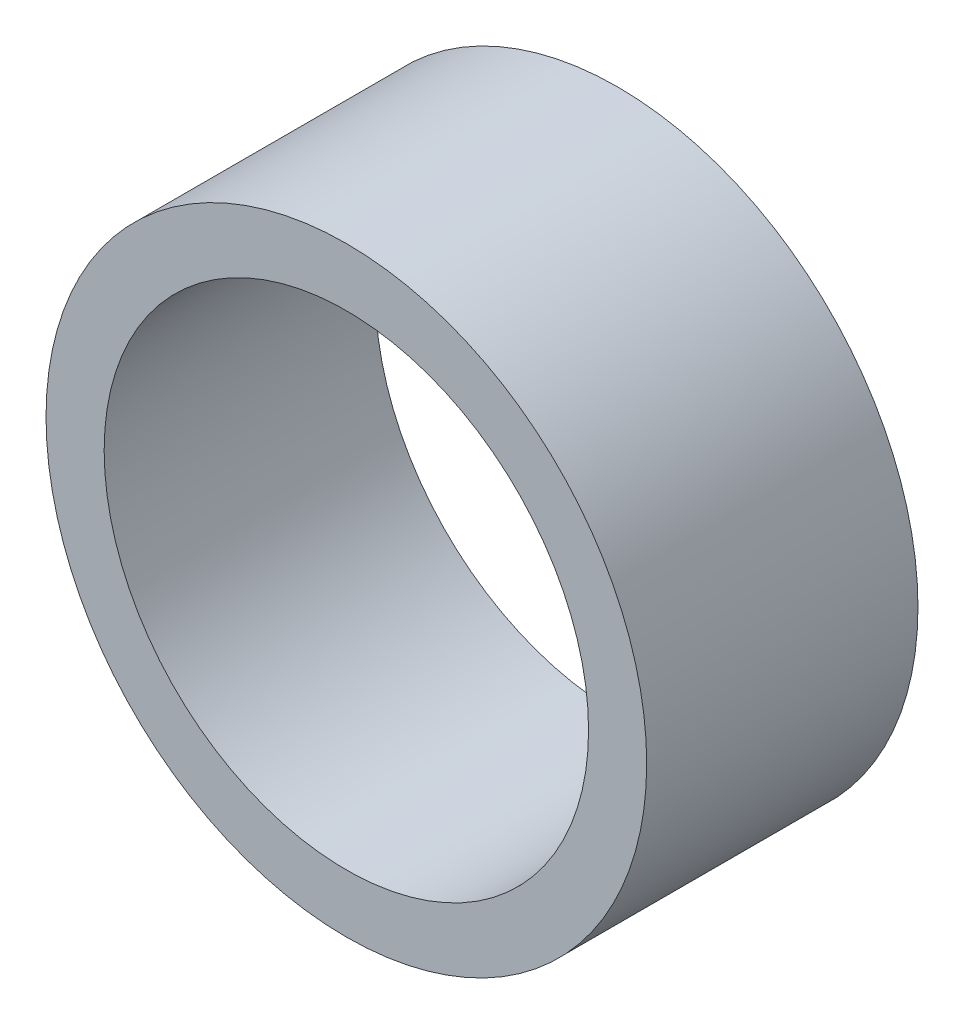
ISO-10303-21;
HEADER;
FILE_DESCRIPTION(('STEP AP214'),'2;1');
FILE_NAME('part.step','',(''),(''),'','','');
FILE_SCHEMA(('AUTOMOTIVE_DESIGN { 1 0 10303 214 1 1 1 1 }'));
ENDSEC;
DATA;
#1=APPLICATION_CONTEXT('core data for automotive mechanical design processes');
#2=APPLICATION_PROTOCOL_DEFINITION('international standard','automotive_design',2000,#1);
#3=PRODUCT_CONTEXT('',#1,'mechanical');
#4=PRODUCT('Part','Part','',(#3));
#5=PRODUCT_RELATED_PRODUCT_CATEGORY('part','',(#4));
#6=PRODUCT_DEFINITION_FORMATION('','',#4);
#7=PRODUCT_DEFINITION_CONTEXT('part definition',#1,'design');
#8=PRODUCT_DEFINITION('design','',#6,#7);
#9=PRODUCT_DEFINITION_SHAPE('','',#8);
#10=(LENGTH_UNIT() NAMED_UNIT(*) SI_UNIT(.MILLI.,.METRE.));
#11=(NAMED_UNIT(*) PLANE_ANGLE_UNIT() SI_UNIT($,.RADIAN.));
#12=(NAMED_UNIT(*) SI_UNIT($,.STERADIAN.) SOLID_ANGLE_UNIT());
#13=UNCERTAINTY_MEASURE_WITH_UNIT(LENGTH_MEASURE(1.E-05),#10,'distance_accuracy_value','');
#14=(GEOMETRIC_REPRESENTATION_CONTEXT(3) GLOBAL_UNCERTAINTY_ASSIGNED_CONTEXT((#13)) GLOBAL_UNIT_ASSIGNED_CONTEXT((#10,
#11,#12)) REPRESENTATION_CONTEXT('',''));
#15=CARTESIAN_POINT('',(0.,0.,0.));
#16=DIRECTION('',(0.,0.,1.));
#17=DIRECTION('',(1.,0.,0.));
#18=AXIS2_PLACEMENT_3D('',#15,#16,#17);
#19=CARTESIAN_POINT('',(0.,0.,14.));
#20=DIRECTION('',(0.,0.,1.));
#21=DIRECTION('',(1.,0.,0.));
#22=AXIS2_PLACEMENT_3D('',#19,#20,#21);
#23=CYLINDRICAL_SURFACE('',#22,12.5);
#24=CARTESIAN_POINT('',(0.,0.,0.));
#25=DIRECTION('',(0.,0.,1.));
#26=DIRECTION('',(1.,0.,0.));
#27=AXIS2_PLACEMENT_3D('',#24,#25,#26);
#28=CIRCLE('',#27,12.5);
#29=CARTESIAN_POINT('',(12.5,0.,0.));
#30=VERTEX_POINT('',#29);
#31=EDGE_CURVE('E26',#30,#30,#28,.F.);
#32=ORIENTED_EDGE('',*,*,#31,.T.);
#33=EDGE_LOOP('',(#32));
#34=FACE_BOUND('',#33,.T.);
#35=CARTESIAN_POINT('',(0.,0.,14.));
#36=DIRECTION('',(0.,0.,1.));
#37=DIRECTION('',(1.,0.,0.));
#38=AXIS2_PLACEMENT_3D('',#35,#36,#37);
#39=CIRCLE('',#38,12.5);
#40=CARTESIAN_POINT('',(12.5,0.,14.));
#41=VERTEX_POINT('',#40);
#42=EDGE_CURVE('E17',#41,#41,#39,.F.);
#43=ORIENTED_EDGE('',*,*,#42,.F.);
#44=EDGE_LOOP('',(#43));
#45=FACE_BOUND('',#44,.T.);
#46=ADVANCED_FACE('F14',(#34,#45),#23,.F.);
#47=CARTESIAN_POINT('',(0.,0.,14.));
#48=DIRECTION('',(0.,0.,1.));
#49=DIRECTION('',(1.,0.,0.));
#50=AXIS2_PLACEMENT_3D('',#47,#48,#49);
#51=PLANE('',#50);
#52=CARTESIAN_POINT('',(0.,0.,14.));
#53=DIRECTION('',(0.,0.,1.));
#54=DIRECTION('',(1.,0.,0.));
#55=AXIS2_PLACEMENT_3D('',#52,#53,#54);
#56=CIRCLE('',#55,15.5);
#57=CARTESIAN_POINT('',(15.5,0.,14.));
#58=VERTEX_POINT('',#57);
#59=EDGE_CURVE('E21',#58,#58,#56,.F.);
#60=ORIENTED_EDGE('',*,*,#59,.F.);
#61=EDGE_LOOP('',(#60));
#62=FACE_BOUND('',#61,.T.);
#63=ORIENTED_EDGE('',*,*,#42,.T.);
#64=EDGE_LOOP('',(#63));
#65=FACE_BOUND('',#64,.T.);
#66=ADVANCED_FACE('F34',(#62,#65),#51,.T.);
#67=CARTESIAN_POINT('',(0.,0.,0.));
#68=DIRECTION('',(0.,0.,1.));
#69=DIRECTION('',(1.,0.,0.));
#70=AXIS2_PLACEMENT_3D('',#67,#68,#69);
#71=PLANE('',#70);
#72=CARTESIAN_POINT('',(0.,0.,0.));
#73=DIRECTION('',(0.,0.,1.));
#74=DIRECTION('',(1.,0.,0.));
#75=AXIS2_PLACEMENT_3D('',#72,#73,#74);
#76=CIRCLE('',#75,15.5);
#77=CARTESIAN_POINT('',(15.5,0.,0.));
#78=VERTEX_POINT('',#77);
#79=EDGE_CURVE('E10',#78,#78,#76,.T.);
#80=ORIENTED_EDGE('',*,*,#79,.F.);
#81=EDGE_LOOP('',(#80));
#82=FACE_BOUND('',#81,.T.);
#83=ORIENTED_EDGE('',*,*,#31,.F.);
#84=EDGE_LOOP('',(#83));
#85=FACE_BOUND('',#84,.T.);
#86=ADVANCED_FACE('F41',(#82,#85),#71,.F.);
#87=CARTESIAN_POINT('',(0.,0.,14.));
#88=DIRECTION('',(0.,0.,1.));
#89=DIRECTION('',(1.,0.,0.));
#90=AXIS2_PLACEMENT_3D('',#87,#88,#89);
#91=CYLINDRICAL_SURFACE('',#90,15.5);
#92=ORIENTED_EDGE('',*,*,#79,.T.);
#93=EDGE_LOOP('',(#92));
#94=FACE_BOUND('',#93,.T.);
#95=ORIENTED_EDGE('',*,*,#59,.T.);
#96=EDGE_LOOP('',(#95));
#97=FACE_BOUND('',#96,.T.);
#98=ADVANCED_FACE('F43',(#94,#97),#91,.T.);
#99=CLOSED_SHELL('',(#46,#66,#86,#98));
#100=MANIFOLD_SOLID_BREP('B1',#99);
#101=ADVANCED_BREP_SHAPE_REPRESENTATION('',(#18,#100),#14);
#102=SHAPE_DEFINITION_REPRESENTATION(#9,#101);
ENDSEC;
END-ISO-10303-21;
